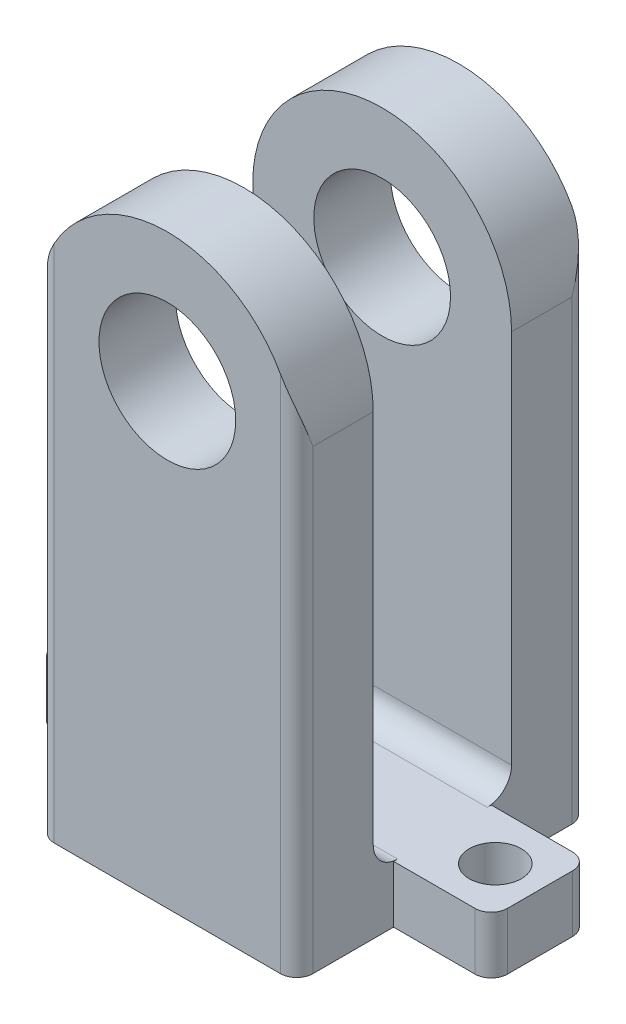
ISO-10303-21;
HEADER;
FILE_DESCRIPTION(('STEP AP214'),'2;1');
FILE_NAME('part.step','',(''),(''),'','','');
FILE_SCHEMA(('AUTOMOTIVE_DESIGN { 1 0 10303 214 1 1 1 1 }'));
ENDSEC;
DATA;
#1=APPLICATION_CONTEXT('core data for automotive mechanical design processes');
#2=APPLICATION_PROTOCOL_DEFINITION('international standard','automotive_design',2000,#1);
#3=PRODUCT_CONTEXT('',#1,'mechanical');
#4=PRODUCT('Part','Part','',(#3));
#5=PRODUCT_RELATED_PRODUCT_CATEGORY('part','',(#4));
#6=PRODUCT_DEFINITION_FORMATION('','',#4);
#7=PRODUCT_DEFINITION_CONTEXT('part definition',#1,'design');
#8=PRODUCT_DEFINITION('design','',#6,#7);
#9=PRODUCT_DEFINITION_SHAPE('','',#8);
#10=(LENGTH_UNIT() NAMED_UNIT(*) SI_UNIT(.MILLI.,.METRE.));
#11=(NAMED_UNIT(*) PLANE_ANGLE_UNIT() SI_UNIT($,.RADIAN.));
#12=(NAMED_UNIT(*) SI_UNIT($,.STERADIAN.) SOLID_ANGLE_UNIT());
#13=UNCERTAINTY_MEASURE_WITH_UNIT(LENGTH_MEASURE(1.E-05),#10,'distance_accuracy_value','');
#14=(GEOMETRIC_REPRESENTATION_CONTEXT(3) GLOBAL_UNCERTAINTY_ASSIGNED_CONTEXT((#13)) GLOBAL_UNIT_ASSIGNED_CONTEXT((#10,
#11,#12)) REPRESENTATION_CONTEXT('',''));
#15=CARTESIAN_POINT('',(0.,0.,0.));
#16=DIRECTION('',(0.,0.,1.));
#17=DIRECTION('',(1.,0.,0.));
#18=AXIS2_PLACEMENT_3D('',#15,#16,#17);
#19=CARTESIAN_POINT('',(0.,36.,8.95000000000001));
#20=DIRECTION('',(0.,0.,-1.));
#21=DIRECTION('',(-1.,0.,0.));
#22=AXIS2_PLACEMENT_3D('',#19,#20,#21);
#23=PLANE('',#22);
#24=CARTESIAN_POINT('',(0.,28.05,8.95000000000001));
#25=DIRECTION('',(0.,0.,1.));
#26=DIRECTION('',(1.,0.,0.));
#27=AXIS2_PLACEMENT_3D('',#24,#25,#26);
#28=CIRCLE('',#27,4.2);
#29=CARTESIAN_POINT('',(4.20000000000001,28.05,8.95000000000001));
#30=VERTEX_POINT('',#29);
#31=EDGE_CURVE('E351',#30,#30,#28,.T.);
#32=ORIENTED_EDGE('',*,*,#31,.F.);
#33=EDGE_LOOP('',(#32));
#34=FACE_BOUND('',#33,.T.);
#35=CARTESIAN_POINT('',(0.,28.05,8.95000000000001));
#36=DIRECTION('',(0.,0.,1.));
#37=DIRECTION('',(1.,0.,0.));
#38=AXIS2_PLACEMENT_3D('',#35,#36,#37);
#39=CIRCLE('',#38,7.95);
#40=CARTESIAN_POINT('',(6.95,31.9100518131238,8.95000000000001));
#41=VERTEX_POINT('',#40);
#42=CARTESIAN_POINT('',(-6.95,31.9100518131238,8.95000000000001));
#43=VERTEX_POINT('',#42);
#44=EDGE_CURVE('E263',#41,#43,#39,.T.);
#45=ORIENTED_EDGE('',*,*,#44,.T.);
#46=DIRECTION('',(0.,-1.,0.));
#47=VECTOR('',#46,1.);
#48=CARTESIAN_POINT('',(-6.94999999999999,36.,8.95000000000001));
#49=LINE('',#48,#47);
#50=CARTESIAN_POINT('',(-6.94999999999999,0.,8.95000000000001));
#51=VERTEX_POINT('',#50);
#52=EDGE_CURVE('E457',#43,#51,#49,.T.);
#53=ORIENTED_EDGE('',*,*,#52,.T.);
#54=DIRECTION('',(1.,0.,0.));
#55=VECTOR('',#54,1.);
#56=CARTESIAN_POINT('',(0.,0.,8.95000000000001));
#57=LINE('',#56,#55);
#58=CARTESIAN_POINT('',(6.95,0.,8.95));
#59=VERTEX_POINT('',#58);
#60=EDGE_CURVE('E472',#51,#59,#57,.T.);
#61=ORIENTED_EDGE('',*,*,#60,.T.);
#62=DIRECTION('',(0.,-1.,0.));
#63=VECTOR('',#62,1.);
#64=CARTESIAN_POINT('',(6.95,36.,8.95));
#65=LINE('',#64,#63);
#66=EDGE_CURVE('E289',#41,#59,#65,.T.);
#67=ORIENTED_EDGE('',*,*,#66,.F.);
#68=EDGE_LOOP('',(#45,#53,#61,#67));
#69=FACE_BOUND('',#68,.T.);
#70=ADVANCED_FACE('F79',(#34,#69),#23,.F.);
#71=CARTESIAN_POINT('',(0.,36.,-8.95000000000001));
#72=DIRECTION('',(0.,0.,-1.));
#73=DIRECTION('',(-1.,0.,0.));
#74=AXIS2_PLACEMENT_3D('',#71,#72,#73);
#75=PLANE('',#74);
#76=CARTESIAN_POINT('',(0.,28.05,-8.95000000000001));
#77=DIRECTION('',(0.,0.,1.));
#78=DIRECTION('',(1.,0.,0.));
#79=AXIS2_PLACEMENT_3D('',#76,#77,#78);
#80=CIRCLE('',#79,4.2);
#81=CARTESIAN_POINT('',(4.20000000000001,28.05,-8.95000000000001));
#82=VERTEX_POINT('',#81);
#83=EDGE_CURVE('E344',#82,#82,#80,.T.);
#84=ORIENTED_EDGE('',*,*,#83,.T.);
#85=EDGE_LOOP('',(#84));
#86=FACE_BOUND('',#85,.T.);
#87=DIRECTION('',(0.,-1.,0.));
#88=VECTOR('',#87,1.);
#89=CARTESIAN_POINT('',(-6.95,36.,-8.95000000000001));
#90=LINE('',#89,#88);
#91=CARTESIAN_POINT('',(-6.95,31.9100518131237,-8.95000000000001));
#92=VERTEX_POINT('',#91);
#93=CARTESIAN_POINT('',(-6.95,0.,-8.95000000000001));
#94=VERTEX_POINT('',#93);
#95=EDGE_CURVE('E269',#92,#94,#90,.T.);
#96=ORIENTED_EDGE('',*,*,#95,.F.);
#97=CARTESIAN_POINT('',(0.,28.05,-8.95000000000001));
#98=DIRECTION('',(0.,0.,1.));
#99=DIRECTION('',(1.,0.,0.));
#100=AXIS2_PLACEMENT_3D('',#97,#98,#99);
#101=CIRCLE('',#100,7.95);
#102=CARTESIAN_POINT('',(6.95,31.9100518131238,-8.95000000000001));
#103=VERTEX_POINT('',#102);
#104=EDGE_CURVE('E252',#103,#92,#101,.T.);
#105=ORIENTED_EDGE('',*,*,#104,.F.);
#106=DIRECTION('',(0.,-1.,0.));
#107=VECTOR('',#106,1.);
#108=CARTESIAN_POINT('',(6.95,36.,-8.95000000000001));
#109=LINE('',#108,#107);
#110=CARTESIAN_POINT('',(6.95,0.,-8.95000000000001));
#111=VERTEX_POINT('',#110);
#112=EDGE_CURVE('E278',#103,#111,#109,.T.);
#113=ORIENTED_EDGE('',*,*,#112,.T.);
#114=DIRECTION('',(1.,0.,0.));
#115=VECTOR('',#114,1.);
#116=CARTESIAN_POINT('',(0.,0.,-8.95000000000001));
#117=LINE('',#116,#115);
#118=EDGE_CURVE('E276',#94,#111,#117,.T.);
#119=ORIENTED_EDGE('',*,*,#118,.F.);
#120=EDGE_LOOP('',(#96,#105,#113,#119));
#121=FACE_BOUND('',#120,.T.);
#122=ADVANCED_FACE('F274',(#86,#121),#75,.T.);
#123=CARTESIAN_POINT('',(13.95,36.,-4.25));
#124=DIRECTION('',(0.,0.,-1.));
#125=DIRECTION('',(0.,1.,0.));
#126=AXIS2_PLACEMENT_3D('',#123,#124,#125);
#127=PLANE('',#126);
#128=CARTESIAN_POINT('',(0.,28.05,-4.25));
#129=DIRECTION('',(0.,0.,-1.));
#130=DIRECTION('',(0.,1.,0.));
#131=AXIS2_PLACEMENT_3D('',#128,#129,#130);
#132=CIRCLE('',#131,4.2);
#133=CARTESIAN_POINT('',(0.,32.25,-4.25));
#134=VERTEX_POINT('',#133);
#135=EDGE_CURVE('E343',#134,#134,#132,.T.);
#136=ORIENTED_EDGE('',*,*,#135,.T.);
#137=EDGE_LOOP('',(#136));
#138=FACE_BOUND('',#137,.T.);
#139=CARTESIAN_POINT('',(0.,28.05,-4.25));
#140=DIRECTION('',(0.,0.,-1.));
#141=DIRECTION('',(0.,1.,0.));
#142=AXIS2_PLACEMENT_3D('',#139,#140,#141);
#143=CIRCLE('',#142,7.95);
#144=CARTESIAN_POINT('',(-7.95,28.05,-4.25));
#145=VERTEX_POINT('',#144);
#146=CARTESIAN_POINT('',(7.95000000000001,28.05,-4.25));
#147=VERTEX_POINT('',#146);
#148=EDGE_CURVE('E348',#145,#147,#143,.T.);
#149=ORIENTED_EDGE('',*,*,#148,.F.);
#150=DIRECTION('',(0.,-1.,0.));
#151=VECTOR('',#150,1.);
#152=CARTESIAN_POINT('',(-7.95,36.,-4.25));
#153=LINE('',#152,#151);
#154=CARTESIAN_POINT('',(-7.95,5.,-4.25000000000001));
#155=VERTEX_POINT('',#154);
#156=EDGE_CURVE('E585',#145,#155,#153,.T.);
#157=ORIENTED_EDGE('',*,*,#156,.T.);
#158=DIRECTION('',(-1.,0.,0.));
#159=VECTOR('',#158,1.);
#160=CARTESIAN_POINT('',(13.95,5.,-4.25));
#161=LINE('',#160,#159);
#162=CARTESIAN_POINT('',(7.95,5.,-4.25));
#163=VERTEX_POINT('',#162);
#164=EDGE_CURVE('E569',#163,#155,#161,.T.);
#165=ORIENTED_EDGE('',*,*,#164,.F.);
#166=DIRECTION('',(0.,-1.,0.));
#167=VECTOR('',#166,1.);
#168=CARTESIAN_POINT('',(7.95,36.,-4.25));
#169=LINE('',#168,#167);
#170=EDGE_CURVE('E542',#147,#163,#169,.T.);
#171=ORIENTED_EDGE('',*,*,#170,.F.);
#172=EDGE_LOOP('',(#149,#157,#165,#171));
#173=FACE_BOUND('',#172,.T.);
#174=ADVANCED_FACE('F617',(#138,#173),#127,.F.);
#175=CARTESIAN_POINT('',(13.95,36.,4.25));
#176=DIRECTION('',(0.,0.,1.));
#177=DIRECTION('',(0.,-1.,0.));
#178=AXIS2_PLACEMENT_3D('',#175,#176,#177);
#179=PLANE('',#178);
#180=CARTESIAN_POINT('',(0.,28.05,4.25));
#181=DIRECTION('',(0.,0.,1.));
#182=DIRECTION('',(0.,-1.,0.));
#183=AXIS2_PLACEMENT_3D('',#180,#181,#182);
#184=CIRCLE('',#183,4.2);
#185=CARTESIAN_POINT('',(0.,23.85,4.25));
#186=VERTEX_POINT('',#185);
#187=EDGE_CURVE('E341',#186,#186,#184,.T.);
#188=ORIENTED_EDGE('',*,*,#187,.T.);
#189=EDGE_LOOP('',(#188));
#190=FACE_BOUND('',#189,.T.);
#191=DIRECTION('',(0.,1.,0.));
#192=VECTOR('',#191,1.);
#193=CARTESIAN_POINT('',(-7.95,36.,4.25));
#194=LINE('',#193,#192);
#195=CARTESIAN_POINT('',(-7.95,5.,4.25));
#196=VERTEX_POINT('',#195);
#197=CARTESIAN_POINT('',(-7.95,28.05,4.25));
#198=VERTEX_POINT('',#197);
#199=EDGE_CURVE('E573',#196,#198,#194,.T.);
#200=ORIENTED_EDGE('',*,*,#199,.T.);
#201=CARTESIAN_POINT('',(0.,28.05,4.25));
#202=DIRECTION('',(0.,0.,1.));
#203=DIRECTION('',(0.,-1.,0.));
#204=AXIS2_PLACEMENT_3D('',#201,#202,#203);
#205=CIRCLE('',#204,7.95);
#206=CARTESIAN_POINT('',(7.95,28.05,4.25));
#207=VERTEX_POINT('',#206);
#208=EDGE_CURVE('E12',#207,#198,#205,.T.);
#209=ORIENTED_EDGE('',*,*,#208,.F.);
#210=DIRECTION('',(0.,1.,0.));
#211=VECTOR('',#210,1.);
#212=CARTESIAN_POINT('',(7.95,36.,4.25));
#213=LINE('',#212,#211);
#214=CARTESIAN_POINT('',(7.95,5.,4.25));
#215=VERTEX_POINT('',#214);
#216=EDGE_CURVE('E544',#215,#207,#213,.T.);
#217=ORIENTED_EDGE('',*,*,#216,.F.);
#218=DIRECTION('',(-1.,0.,0.));
#219=VECTOR('',#218,1.);
#220=CARTESIAN_POINT('',(13.95,5.,4.25000000000001));
#221=LINE('',#220,#219);
#222=EDGE_CURVE('E568',#215,#196,#221,.T.);
#223=ORIENTED_EDGE('',*,*,#222,.T.);
#224=EDGE_LOOP('',(#200,#209,#217,#223));
#225=FACE_BOUND('',#224,.T.);
#226=ADVANCED_FACE('F613',(#190,#225),#179,.F.);
#227=CARTESIAN_POINT('',(-6.95,36.,-7.95));
#228=DIRECTION('',(0.,-1.,0.));
#229=DIRECTION('',(0.,0.,-1.));
#230=AXIS2_PLACEMENT_3D('',#227,#228,#229);
#231=CYLINDRICAL_SURFACE('',#230,1.);
#232=DIRECTION('',(0.,-1.,0.));
#233=VECTOR('',#232,1.);
#234=CARTESIAN_POINT('',(-7.95,36.,-7.95));
#235=LINE('',#234,#233);
#236=CARTESIAN_POINT('',(-7.95,28.05,-7.95));
#237=VERTEX_POINT('',#236);
#238=CARTESIAN_POINT('',(-7.95,0.,-7.95));
#239=VERTEX_POINT('',#238);
#240=EDGE_CURVE('E271',#237,#239,#235,.T.);
#241=ORIENTED_EDGE('',*,*,#240,.F.);
#242=CARTESIAN_POINT('',(-6.95,31.9100518131238,-8.95));
#243=CARTESIAN_POINT('',(-6.98196957690838,31.8524932022334,-8.94999105364568));
#244=CARTESIAN_POINT('',(-7.01321143036814,31.7945552499935,-8.94846815566665));
#245=CARTESIAN_POINT('',(-7.07418330680163,31.6780500916359,-8.94273329318418));
#246=CARTESIAN_POINT('',(-7.10391397826668,31.6194831687225,-8.93852249283603));
#247=CARTESIAN_POINT('',(-7.1906636865138,31.4432250551329,-8.92238833535052));
#248=CARTESIAN_POINT('',(-7.24538600971994,31.3247141109602,-8.9069600865594));
#249=CARTESIAN_POINT('',(-7.34829715396004,31.0867367492369,-8.86888738764515));
#250=CARTESIAN_POINT('',(-7.39651452418672,30.9672771172871,-8.84627603536577));
#251=CARTESIAN_POINT('',(-7.48676855125309,30.7271741436401,-8.79531932279048));
#252=CARTESIAN_POINT('',(-7.52880060460707,30.6065299908738,-8.76696972865254));
#253=CARTESIAN_POINT('',(-7.6317744010863,30.2865526451457,-8.68608268360056));
#254=CARTESIAN_POINT('',(-7.68750287763086,30.0864897392749,-8.62971148798475));
#255=CARTESIAN_POINT('',(-7.78278866369012,29.6850330622182,-8.50891052122256));
#256=CARTESIAN_POINT('',(-7.82233901986873,29.4836387565071,-8.44447730053193));
#257=CARTESIAN_POINT('',(-7.91732867090153,28.8779003985088,-8.24362857351878));
#258=CARTESIAN_POINT('',(-7.94912616679685,28.4719388902881,-8.09964635034349));
#259=CARTESIAN_POINT('',(-7.94999407288117,28.0612043917698,-7.95397376413446));
#260=CARTESIAN_POINT('',(-7.94999999416563,28.0556021126278,-7.95198683997217));
#261=CARTESIAN_POINT('',(-7.95,28.05,-7.95));
#262=B_SPLINE_CURVE_WITH_KNOTS('',3,(#242,#243,#244,#245,#246,#247,#248,#249,#250,#251,#252,
#253,#254,#255,#256,#257,#258,#259,#260,#261),.UNSPECIFIED.,.F.,.F.,(4,2,2,2,2,2,2,2,2,4),(0.,
0.197466297953649,0.394847129408488,0.788711816861617,1.18078737943405,1.57315328825401,
2.21774444285081,2.86261235156548,4.15214798750188,4.16998055085129),.UNSPECIFIED.);
#263=EDGE_CURVE('E256',#237,#92,#262,.F.);
#264=ORIENTED_EDGE('',*,*,#263,.T.);
#265=ORIENTED_EDGE('',*,*,#95,.T.);
#266=CARTESIAN_POINT('',(-6.95,0.,-7.95));
#267=DIRECTION('',(0.,1.,0.));
#268=DIRECTION('',(0.,0.,1.));
#269=AXIS2_PLACEMENT_3D('',#266,#267,#268);
#270=CIRCLE('',#269,1.);
#271=EDGE_CURVE('E448',#239,#94,#270,.F.);
#272=ORIENTED_EDGE('',*,*,#271,.F.);
#273=EDGE_LOOP('',(#241,#264,#265,#272));
#274=FACE_BOUND('',#273,.T.);
#275=ADVANCED_FACE('F267',(#274),#231,.T.);
#276=CARTESIAN_POINT('',(-6.95,36.,7.95));
#277=DIRECTION('',(0.,-1.,0.));
#278=DIRECTION('',(0.,0.,-1.));
#279=AXIS2_PLACEMENT_3D('',#276,#277,#278);
#280=CYLINDRICAL_SURFACE('',#279,1.);
#281=ORIENTED_EDGE('',*,*,#52,.F.);
#282=CARTESIAN_POINT('',(-6.94999999999999,31.9100518131238,8.95000000000001));
#283=CARTESIAN_POINT('',(-6.9819695769084,31.8524932022333,8.94999105364569));
#284=CARTESIAN_POINT('',(-7.01321143036819,31.7945552499934,8.94846815566665));
#285=CARTESIAN_POINT('',(-7.07418330680172,31.6780500916357,8.94273329318418));
#286=CARTESIAN_POINT('',(-7.10391397826679,31.6194831687223,8.93852249283602));
#287=CARTESIAN_POINT('',(-7.19066368651397,31.4432250551326,8.92238833535049));
#288=CARTESIAN_POINT('',(-7.24538600972013,31.3247141109598,8.90696008655935));
#289=CARTESIAN_POINT('',(-7.3482971539602,31.0867367492365,8.86888738764508));
#290=CARTESIAN_POINT('',(-7.39651452418684,30.9672771172868,8.8462760353657));
#291=CARTESIAN_POINT('',(-7.48676855125314,30.72717414364,8.79531932279045));
#292=CARTESIAN_POINT('',(-7.52880060460709,30.6065299908737,8.76696972865255));
#293=CARTESIAN_POINT('',(-7.6317744010863,30.2865526451457,8.68608268360053));
#294=CARTESIAN_POINT('',(-7.68750287763085,30.086489739275,8.62971148798459));
#295=CARTESIAN_POINT('',(-7.7827886636901,29.6850330622183,8.50891052122277));
#296=CARTESIAN_POINT('',(-7.8223390198687,29.483638756507,8.44447730053262));
#297=CARTESIAN_POINT('',(-7.91732867090153,28.8779003985094,8.2436285735175));
#298=CARTESIAN_POINT('',(-7.9491261667969,28.4719388902906,8.09964635033632));
#299=CARTESIAN_POINT('',(-7.94999407288116,28.0612043917699,7.95397376413426));
#300=CARTESIAN_POINT('',(-7.94999999416563,28.0556021126279,7.95198683997207));
#301=CARTESIAN_POINT('',(-7.95,28.05,7.95));
#302=B_SPLINE_CURVE_WITH_KNOTS('',3,(#282,#283,#284,#285,#286,#287,#288,#289,#290,#291,#292,
#293,#294,#295,#296,#297,#298,#299,#300,#301),.UNSPECIFIED.,.F.,.F.,(4,2,2,2,2,2,2,2,2,4),(0.,
0.197466297953814,0.394847129408806,0.788711816862168,1.18078737943431,1.573153288254,
2.21774444285077,2.86261235156531,4.15214798750191,4.16998055085129),.UNSPECIFIED.);
#303=CARTESIAN_POINT('',(-7.95,28.05,7.95));
#304=VERTEX_POINT('',#303);
#305=EDGE_CURVE('E272',#43,#304,#302,.T.);
#306=ORIENTED_EDGE('',*,*,#305,.T.);
#307=DIRECTION('',(0.,-1.,0.));
#308=VECTOR('',#307,1.);
#309=CARTESIAN_POINT('',(-7.95,36.,7.95));
#310=LINE('',#309,#308);
#311=CARTESIAN_POINT('',(-7.95,0.,7.95));
#312=VERTEX_POINT('',#311);
#313=EDGE_CURVE('E282',#304,#312,#310,.T.);
#314=ORIENTED_EDGE('',*,*,#313,.T.);
#315=CARTESIAN_POINT('',(-6.95,0.,7.95));
#316=DIRECTION('',(0.,1.,0.));
#317=DIRECTION('',(0.,0.,1.));
#318=AXIS2_PLACEMENT_3D('',#315,#316,#317);
#319=CIRCLE('',#318,1.);
#320=EDGE_CURVE('E451',#51,#312,#319,.F.);
#321=ORIENTED_EDGE('',*,*,#320,.F.);
#322=EDGE_LOOP('',(#281,#306,#314,#321));
#323=FACE_BOUND('',#322,.T.);
#324=ADVANCED_FACE('F394',(#323),#280,.T.);
#325=CARTESIAN_POINT('',(6.95,36.,7.95));
#326=DIRECTION('',(0.,-1.,0.));
#327=DIRECTION('',(0.,0.,-1.));
#328=AXIS2_PLACEMENT_3D('',#325,#326,#327);
#329=CYLINDRICAL_SURFACE('',#328,1.);
#330=DIRECTION('',(0.,-1.,0.));
#331=VECTOR('',#330,1.);
#332=CARTESIAN_POINT('',(7.95,36.,7.95));
#333=LINE('',#332,#331);
#334=CARTESIAN_POINT('',(7.95000000000001,28.05,7.95));
#335=VERTEX_POINT('',#334);
#336=CARTESIAN_POINT('',(7.95,0.,7.95));
#337=VERTEX_POINT('',#336);
#338=EDGE_CURVE('E287',#335,#337,#333,.T.);
#339=ORIENTED_EDGE('',*,*,#338,.F.);
#340=CARTESIAN_POINT('',(6.95,31.9100518131238,8.95));
#341=CARTESIAN_POINT('',(6.98196957690846,31.8524932022332,8.94999105364568));
#342=CARTESIAN_POINT('',(7.0132114303683,31.7945552499932,8.94846815566665));
#343=CARTESIAN_POINT('',(7.07418330680192,31.6780500916353,8.94273329318415));
#344=CARTESIAN_POINT('',(7.10391397826704,31.6194831687218,8.93852249283598));
#345=CARTESIAN_POINT('',(7.19066368651431,31.4432250551319,8.9223883353504));
#346=CARTESIAN_POINT('',(7.24538600972054,31.3247141109589,8.90696008655923));
#347=CARTESIAN_POINT('',(7.34829715396056,31.0867367492356,8.86888738764491));
#348=CARTESIAN_POINT('',(7.39651452418711,30.9672771172861,8.84627603536555));
#349=CARTESIAN_POINT('',(7.48676855125326,30.7271741436397,8.79531932279038));
#350=CARTESIAN_POINT('',(7.52880060460715,30.6065299908735,8.76696972865254));
#351=CARTESIAN_POINT('',(7.6317744010863,30.2865526451457,8.68608268360046));
#352=CARTESIAN_POINT('',(7.68750287763084,30.0864897392752,8.62971148798425));
#353=CARTESIAN_POINT('',(7.78278866369006,29.6850330622183,8.50891052122317));
#354=CARTESIAN_POINT('',(7.82233901986865,29.4836387565068,8.44447730053404));
#355=CARTESIAN_POINT('',(7.91732867090154,28.8779003985106,8.2436285735149));
#356=CARTESIAN_POINT('',(7.94912616679698,28.471938890296,8.0996463503217));
#357=CARTESIAN_POINT('',(7.94999407288117,28.0612043917701,7.95397376413386));
#358=CARTESIAN_POINT('',(7.94999999416563,28.0556021126279,7.95198683997186));
#359=CARTESIAN_POINT('',(7.95,28.05,7.95));
#360=B_SPLINE_CURVE_WITH_KNOTS('',3,(#340,#341,#342,#343,#344,#345,#346,#347,#348,#349,#350,
#351,#352,#353,#354,#355,#356,#357,#358,#359),.UNSPECIFIED.,.F.,.F.,(4,2,2,2,2,2,2,2,2,4),(0.,
0.197466297954126,0.394847129409439,0.788711816863296,1.18078737943484,1.57315328825401,
2.21774444285067,2.86261235156492,4.15214798750188,4.16998055085128),.UNSPECIFIED.);
#361=EDGE_CURVE('E369',#335,#41,#360,.F.);
#362=ORIENTED_EDGE('',*,*,#361,.T.);
#363=ORIENTED_EDGE('',*,*,#66,.T.);
#364=CARTESIAN_POINT('',(6.95,0.,7.95));
#365=DIRECTION('',(0.,1.,0.));
#366=DIRECTION('',(0.,0.,1.));
#367=AXIS2_PLACEMENT_3D('',#364,#365,#366);
#368=CIRCLE('',#367,1.);
#369=EDGE_CURVE('E475',#337,#59,#368,.F.);
#370=ORIENTED_EDGE('',*,*,#369,.F.);
#371=EDGE_LOOP('',(#339,#362,#363,#370));
#372=FACE_BOUND('',#371,.T.);
#373=ADVANCED_FACE('F384',(#372),#329,.T.);
#374=CARTESIAN_POINT('',(6.95,36.,-7.95));
#375=DIRECTION('',(0.,-1.,0.));
#376=DIRECTION('',(0.,0.,-1.));
#377=AXIS2_PLACEMENT_3D('',#374,#375,#376);
#378=CYLINDRICAL_SURFACE('',#377,1.);
#379=CARTESIAN_POINT('',(6.95,31.9100518131238,-8.95));
#380=CARTESIAN_POINT('',(6.98196957690845,31.8524932022332,-8.94999105364568));
#381=CARTESIAN_POINT('',(7.01321143036829,31.7945552499932,-8.94846815566665));
#382=CARTESIAN_POINT('',(7.07418330680192,31.6780500916353,-8.94273329318415));
#383=CARTESIAN_POINT('',(7.10391397826703,31.6194831687218,-8.93852249283598));
#384=CARTESIAN_POINT('',(7.19066368651431,31.4432250551319,-8.9223883353504));
#385=CARTESIAN_POINT('',(7.24538600972053,31.3247141109589,-8.90696008655923));
#386=CARTESIAN_POINT('',(7.34829715396055,31.0867367492356,-8.86888738764491));
#387=CARTESIAN_POINT('',(7.3965145241871,30.9672771172861,-8.84627603536555));
#388=CARTESIAN_POINT('',(7.48676855125326,30.7271741436397,-8.79531932279038));
#389=CARTESIAN_POINT('',(7.52880060460714,30.6065299908735,-8.76696972865254));
#390=CARTESIAN_POINT('',(7.63177440108629,30.2865526451458,-8.68608268360046));
#391=CARTESIAN_POINT('',(7.68750287763084,30.0864897392752,-8.62971148798426));
#392=CARTESIAN_POINT('',(7.78278866369006,29.6850330622183,-8.50891052122317));
#393=CARTESIAN_POINT('',(7.82233901986864,29.4836387565068,-8.44447730053405));
#394=CARTESIAN_POINT('',(7.91732867090153,28.8779003985106,-8.2436285735149));
#395=CARTESIAN_POINT('',(7.94912616679698,28.471938890296,-8.09964635032167));
#396=CARTESIAN_POINT('',(7.94999407288117,28.0612043917701,-7.95397376413386));
#397=CARTESIAN_POINT('',(7.94999999416563,28.0556021126279,-7.95198683997186));
#398=CARTESIAN_POINT('',(7.95,28.05,-7.95));
#399=B_SPLINE_CURVE_WITH_KNOTS('',3,(#379,#380,#381,#382,#383,#384,#385,#386,#387,#388,#389,
#390,#391,#392,#393,#394,#395,#396,#397,#398),.UNSPECIFIED.,.F.,.F.,(4,2,2,2,2,2,2,2,2,4),(0.,
0.197466297954127,0.39484712940944,0.788711816863293,1.18078737943482,1.57315328825399,
2.21774444285065,2.86261235156491,4.15214798750189,4.16998055085129),.UNSPECIFIED.);
#400=CARTESIAN_POINT('',(7.95000000000001,28.05,-7.95));
#401=VERTEX_POINT('',#400);
#402=EDGE_CURVE('E259',#401,#103,#399,.F.);
#403=ORIENTED_EDGE('',*,*,#402,.F.);
#404=DIRECTION('',(0.,-1.,0.));
#405=VECTOR('',#404,1.);
#406=CARTESIAN_POINT('',(7.95,36.,-7.95));
#407=LINE('',#406,#405);
#408=CARTESIAN_POINT('',(7.95,0.,-7.95));
#409=VERTEX_POINT('',#408);
#410=EDGE_CURVE('E280',#401,#409,#407,.T.);
#411=ORIENTED_EDGE('',*,*,#410,.T.);
#412=CARTESIAN_POINT('',(6.95,0.,-7.95));
#413=DIRECTION('',(0.,1.,0.));
#414=DIRECTION('',(0.,0.,1.));
#415=AXIS2_PLACEMENT_3D('',#412,#413,#414);
#416=CIRCLE('',#415,1.);
#417=EDGE_CURVE('E488',#409,#111,#416,.T.);
#418=ORIENTED_EDGE('',*,*,#417,.T.);
#419=ORIENTED_EDGE('',*,*,#112,.F.);
#420=EDGE_LOOP('',(#403,#411,#418,#419));
#421=FACE_BOUND('',#420,.T.);
#422=ADVANCED_FACE('F378',(#421),#378,.T.);
#423=CARTESIAN_POINT('',(7.95,36.,0.));
#424=DIRECTION('',(-1.,0.,0.));
#425=DIRECTION('',(0.,0.,1.));
#426=AXIS2_PLACEMENT_3D('',#423,#424,#425);
#427=PLANE('',#426);
#428=ORIENTED_EDGE('',*,*,#216,.T.);
#429=DIRECTION('',(0.,0.,1.));
#430=VECTOR('',#429,1.);
#431=CARTESIAN_POINT('',(7.95000000000001,28.05,-8.95000000000001));
#432=LINE('',#431,#430);
#433=EDGE_CURVE('E93',#207,#335,#432,.T.);
#434=ORIENTED_EDGE('',*,*,#433,.T.);
#435=ORIENTED_EDGE('',*,*,#338,.T.);
#436=DIRECTION('',(0.,0.,-1.));
#437=VECTOR('',#436,1.);
#438=CARTESIAN_POINT('',(7.95,0.,0.));
#439=LINE('',#438,#437);
#440=CARTESIAN_POINT('',(7.95,0.,3.));
#441=VERTEX_POINT('',#440);
#442=EDGE_CURVE('E486',#337,#441,#439,.T.);
#443=ORIENTED_EDGE('',*,*,#442,.T.);
#444=DIRECTION('',(0.,-1.,0.));
#445=VECTOR('',#444,1.);
#446=CARTESIAN_POINT('',(7.95,3.5,3.));
#447=LINE('',#446,#445);
#448=CARTESIAN_POINT('',(7.95,3.5,3.));
#449=VERTEX_POINT('',#448);
#450=EDGE_CURVE('E501',#449,#441,#447,.T.);
#451=ORIENTED_EDGE('',*,*,#450,.F.);
#452=DIRECTION('',(0.,0.,-1.));
#453=VECTOR('',#452,1.);
#454=CARTESIAN_POINT('',(7.95,3.5,0.));
#455=LINE('',#454,#453);
#456=CARTESIAN_POINT('',(7.95,3.5,2.75));
#457=VERTEX_POINT('',#456);
#458=EDGE_CURVE('E552',#449,#457,#455,.T.);
#459=ORIENTED_EDGE('',*,*,#458,.T.);
#460=CARTESIAN_POINT('',(7.95,5.,2.75000000000001));
#461=DIRECTION('',(-1.,0.,0.));
#462=DIRECTION('',(0.,0.,1.));
#463=AXIS2_PLACEMENT_3D('',#460,#461,#462);
#464=CIRCLE('',#463,1.5);
#465=EDGE_CURVE('E563',#457,#215,#464,.T.);
#466=ORIENTED_EDGE('',*,*,#465,.T.);
#467=EDGE_LOOP('',(#428,#434,#435,#443,#451,#459,#466));
#468=FACE_BOUND('',#467,.T.);
#469=ADVANCED_FACE('F383',(#468),#427,.F.);
#470=CARTESIAN_POINT('',(-7.95,36.,0.));
#471=DIRECTION('',(-1.,0.,0.));
#472=DIRECTION('',(0.,0.,1.));
#473=AXIS2_PLACEMENT_3D('',#470,#471,#472);
#474=PLANE('',#473);
#475=DIRECTION('',(0.,0.,1.));
#476=VECTOR('',#475,1.);
#477=CARTESIAN_POINT('',(-7.95,28.05,-8.95000000000001));
#478=LINE('',#477,#476);
#479=EDGE_CURVE('E592',#198,#304,#478,.T.);
#480=ORIENTED_EDGE('',*,*,#479,.F.);
#481=ORIENTED_EDGE('',*,*,#199,.F.);
#482=CARTESIAN_POINT('',(-7.95,5.,2.75));
#483=DIRECTION('',(-1.,0.,0.));
#484=DIRECTION('',(0.,0.,1.));
#485=AXIS2_PLACEMENT_3D('',#482,#483,#484);
#486=CIRCLE('',#485,1.5);
#487=CARTESIAN_POINT('',(-7.95,3.5,2.75));
#488=VERTEX_POINT('',#487);
#489=EDGE_CURVE('E580',#488,#196,#486,.T.);
#490=ORIENTED_EDGE('',*,*,#489,.F.);
#491=DIRECTION('',(0.,0.,-1.));
#492=VECTOR('',#491,1.);
#493=CARTESIAN_POINT('',(-7.95,3.5,0.));
#494=LINE('',#493,#492);
#495=CARTESIAN_POINT('',(-7.95,3.5,3.));
#496=VERTEX_POINT('',#495);
#497=EDGE_CURVE('E308',#496,#488,#494,.T.);
#498=ORIENTED_EDGE('',*,*,#497,.F.);
#499=DIRECTION('',(0.,-1.,0.));
#500=VECTOR('',#499,1.);
#501=CARTESIAN_POINT('',(-7.95,3.5,3.));
#502=LINE('',#501,#500);
#503=CARTESIAN_POINT('',(-7.95,0.,3.));
#504=VERTEX_POINT('',#503);
#505=EDGE_CURVE('E333',#496,#504,#502,.T.);
#506=ORIENTED_EDGE('',*,*,#505,.T.);
#507=DIRECTION('',(0.,0.,-1.));
#508=VECTOR('',#507,1.);
#509=CARTESIAN_POINT('',(-7.95,0.,0.));
#510=LINE('',#509,#508);
#511=EDGE_CURVE('E447',#312,#504,#510,.T.);
#512=ORIENTED_EDGE('',*,*,#511,.F.);
#513=ORIENTED_EDGE('',*,*,#313,.F.);
#514=EDGE_LOOP('',(#480,#481,#490,#498,#506,#512,#513));
#515=FACE_BOUND('',#514,.T.);
#516=ADVANCED_FACE('F390',(#515),#474,.T.);
#517=ORIENTED_EDGE('',*,*,#410,.F.);
#518=EDGE_CURVE('E356',#401,#147,#432,.T.);
#519=ORIENTED_EDGE('',*,*,#518,.T.);
#520=ORIENTED_EDGE('',*,*,#170,.T.);
#521=CARTESIAN_POINT('',(7.95,5.,-2.75));
#522=DIRECTION('',(-1.,0.,0.));
#523=DIRECTION('',(0.,0.,1.));
#524=AXIS2_PLACEMENT_3D('',#521,#522,#523);
#525=CIRCLE('',#524,1.5);
#526=CARTESIAN_POINT('',(7.95,3.5,-2.75));
#527=VERTEX_POINT('',#526);
#528=EDGE_CURVE('E566',#163,#527,#525,.T.);
#529=ORIENTED_EDGE('',*,*,#528,.T.);
#530=CARTESIAN_POINT('',(7.95,3.5,-3.00000000000001));
#531=VERTEX_POINT('',#530);
#532=EDGE_CURVE('E101',#527,#531,#455,.T.);
#533=ORIENTED_EDGE('',*,*,#532,.T.);
#534=DIRECTION('',(0.,-1.,0.));
#535=VECTOR('',#534,1.);
#536=CARTESIAN_POINT('',(7.95,3.5,-3.));
#537=LINE('',#536,#535);
#538=CARTESIAN_POINT('',(7.95,0.,-3.));
#539=VERTEX_POINT('',#538);
#540=EDGE_CURVE('E496',#531,#539,#537,.T.);
#541=ORIENTED_EDGE('',*,*,#540,.T.);
#542=EDGE_CURVE('E480',#539,#409,#439,.T.);
#543=ORIENTED_EDGE('',*,*,#542,.T.);
#544=EDGE_LOOP('',(#517,#519,#520,#529,#533,#541,#543));
#545=FACE_BOUND('',#544,.T.);
#546=ADVANCED_FACE('F387',(#545),#427,.F.);
#547=CARTESIAN_POINT('',(-12.95,3.5,-2.));
#548=DIRECTION('',(0.,-1.,0.));
#549=DIRECTION('',(0.,0.,-1.));
#550=AXIS2_PLACEMENT_3D('',#547,#548,#549);
#551=CYLINDRICAL_SURFACE('',#550,1.);
#552=CARTESIAN_POINT('',(-12.95,0.,-2.));
#553=DIRECTION('',(0.,1.,0.));
#554=DIRECTION('',(0.,0.,1.));
#555=AXIS2_PLACEMENT_3D('',#552,#553,#554);
#556=CIRCLE('',#555,1.);
#557=CARTESIAN_POINT('',(-13.95,0.,-2.));
#558=VERTEX_POINT('',#557);
#559=CARTESIAN_POINT('',(-12.95,0.,-3.));
#560=VERTEX_POINT('',#559);
#561=EDGE_CURVE('E317',#558,#560,#556,.F.);
#562=ORIENTED_EDGE('',*,*,#561,.F.);
#563=DIRECTION('',(0.,-1.,0.));
#564=VECTOR('',#563,1.);
#565=CARTESIAN_POINT('',(-13.95,3.5,-2.));
#566=LINE('',#565,#564);
#567=CARTESIAN_POINT('',(-13.95,3.5,-2.));
#568=VERTEX_POINT('',#567);
#569=EDGE_CURVE('E87',#568,#558,#566,.T.);
#570=ORIENTED_EDGE('',*,*,#569,.F.);
#571=CARTESIAN_POINT('',(-12.95,3.5,-2.));
#572=DIRECTION('',(0.,1.,0.));
#573=DIRECTION('',(0.,0.,1.));
#574=AXIS2_PLACEMENT_3D('',#571,#572,#573);
#575=CIRCLE('',#574,1.);
#576=CARTESIAN_POINT('',(-12.95,3.5,-3.));
#577=VERTEX_POINT('',#576);
#578=EDGE_CURVE('E295',#568,#577,#575,.F.);
#579=ORIENTED_EDGE('',*,*,#578,.T.);
#580=DIRECTION('',(0.,-1.,0.));
#581=VECTOR('',#580,1.);
#582=CARTESIAN_POINT('',(-12.95,3.5,-3.));
#583=LINE('',#582,#581);
#584=EDGE_CURVE('E314',#577,#560,#583,.T.);
#585=ORIENTED_EDGE('',*,*,#584,.T.);
#586=EDGE_LOOP('',(#562,#570,#579,#585));
#587=FACE_BOUND('',#586,.T.);
#588=ADVANCED_FACE('F389',(#587),#551,.T.);
#589=CARTESIAN_POINT('',(-13.95,3.5,0.));
#590=DIRECTION('',(-1.,0.,0.));
#591=DIRECTION('',(0.,0.,1.));
#592=AXIS2_PLACEMENT_3D('',#589,#590,#591);
#593=PLANE('',#592);
#594=DIRECTION('',(0.,0.,-1.));
#595=VECTOR('',#594,1.);
#596=CARTESIAN_POINT('',(-13.95,0.,0.));
#597=LINE('',#596,#595);
#598=CARTESIAN_POINT('',(-13.95,0.,2.));
#599=VERTEX_POINT('',#598);
#600=EDGE_CURVE('E320',#599,#558,#597,.T.);
#601=ORIENTED_EDGE('',*,*,#600,.F.);
#602=DIRECTION('',(0.,-1.,0.));
#603=VECTOR('',#602,1.);
#604=CARTESIAN_POINT('',(-13.95,3.5,2.));
#605=LINE('',#604,#603);
#606=CARTESIAN_POINT('',(-13.95,3.5,2.));
#607=VERTEX_POINT('',#606);
#608=EDGE_CURVE('E339',#607,#599,#605,.T.);
#609=ORIENTED_EDGE('',*,*,#608,.F.);
#610=DIRECTION('',(0.,0.,-1.));
#611=VECTOR('',#610,1.);
#612=CARTESIAN_POINT('',(-13.95,3.5,0.));
#613=LINE('',#612,#611);
#614=EDGE_CURVE('E299',#607,#568,#613,.T.);
#615=ORIENTED_EDGE('',*,*,#614,.T.);
#616=ORIENTED_EDGE('',*,*,#569,.T.);
#617=EDGE_LOOP('',(#601,#609,#615,#616));
#618=FACE_BOUND('',#617,.T.);
#619=ADVANCED_FACE('F419',(#618),#593,.T.);
#620=CARTESIAN_POINT('',(-12.95,3.5,2.));
#621=DIRECTION('',(0.,-1.,0.));
#622=DIRECTION('',(0.,0.,-1.));
#623=AXIS2_PLACEMENT_3D('',#620,#621,#622);
#624=CYLINDRICAL_SURFACE('',#623,1.);
#625=CARTESIAN_POINT('',(-12.95,0.,2.));
#626=DIRECTION('',(0.,1.,0.));
#627=DIRECTION('',(0.,0.,1.));
#628=AXIS2_PLACEMENT_3D('',#625,#626,#627);
#629=CIRCLE('',#628,1.);
#630=CARTESIAN_POINT('',(-12.95,0.,3.));
#631=VERTEX_POINT('',#630);
#632=EDGE_CURVE('E323',#599,#631,#629,.T.);
#633=ORIENTED_EDGE('',*,*,#632,.T.);
#634=DIRECTION('',(0.,-1.,0.));
#635=VECTOR('',#634,1.);
#636=CARTESIAN_POINT('',(-12.95,3.5,3.));
#637=LINE('',#636,#635);
#638=CARTESIAN_POINT('',(-12.95,3.5,3.));
#639=VERTEX_POINT('',#638);
#640=EDGE_CURVE('E336',#639,#631,#637,.T.);
#641=ORIENTED_EDGE('',*,*,#640,.F.);
#642=CARTESIAN_POINT('',(-12.95,3.5,2.));
#643=DIRECTION('',(0.,1.,0.));
#644=DIRECTION('',(0.,0.,1.));
#645=AXIS2_PLACEMENT_3D('',#642,#643,#644);
#646=CIRCLE('',#645,1.);
#647=EDGE_CURVE('E302',#607,#639,#646,.T.);
#648=ORIENTED_EDGE('',*,*,#647,.F.);
#649=ORIENTED_EDGE('',*,*,#608,.T.);
#650=EDGE_LOOP('',(#633,#641,#648,#649));
#651=FACE_BOUND('',#650,.T.);
#652=ADVANCED_FACE('F415',(#651),#624,.T.);
#653=CARTESIAN_POINT('',(0.,3.5,3.));
#654=DIRECTION('',(0.,0.,-1.));
#655=DIRECTION('',(-1.,0.,0.));
#656=AXIS2_PLACEMENT_3D('',#653,#654,#655);
#657=PLANE('',#656);
#658=DIRECTION('',(1.,0.,0.));
#659=VECTOR('',#658,1.);
#660=CARTESIAN_POINT('',(0.,0.,3.));
#661=LINE('',#660,#659);
#662=EDGE_CURVE('E326',#631,#504,#661,.T.);
#663=ORIENTED_EDGE('',*,*,#662,.T.);
#664=ORIENTED_EDGE('',*,*,#505,.F.);
#665=DIRECTION('',(1.,0.,0.));
#666=VECTOR('',#665,1.);
#667=CARTESIAN_POINT('',(0.,3.5,3.));
#668=LINE('',#667,#666);
#669=EDGE_CURVE('E305',#639,#496,#668,.T.);
#670=ORIENTED_EDGE('',*,*,#669,.F.);
#671=ORIENTED_EDGE('',*,*,#640,.T.);
#672=EDGE_LOOP('',(#663,#664,#670,#671));
#673=FACE_BOUND('',#672,.T.);
#674=ADVANCED_FACE('F412',(#673),#657,.F.);
#675=CARTESIAN_POINT('',(-11.2,3.5,0.));
#676=DIRECTION('',(0.,-1.,0.));
#677=DIRECTION('',(0.,0.,-1.));
#678=AXIS2_PLACEMENT_3D('',#675,#676,#677);
#679=CYLINDRICAL_SURFACE('',#678,1.6);
#680=CARTESIAN_POINT('',(-11.2,3.5,0.));
#681=DIRECTION('',(0.,1.,0.));
#682=DIRECTION('',(0.,0.,1.));
#683=AXIS2_PLACEMENT_3D('',#680,#681,#682);
#684=CIRCLE('',#683,1.6);
#685=CARTESIAN_POINT('',(-11.2,3.5,1.6));
#686=VERTEX_POINT('',#685);
#687=EDGE_CURVE('E292',#686,#686,#684,.T.);
#688=ORIENTED_EDGE('',*,*,#687,.T.);
#689=EDGE_LOOP('',(#688));
#690=FACE_BOUND('',#689,.T.);
#691=CARTESIAN_POINT('',(-11.2,0.,0.));
#692=DIRECTION('',(0.,1.,0.));
#693=DIRECTION('',(0.,0.,1.));
#694=AXIS2_PLACEMENT_3D('',#691,#692,#693);
#695=CIRCLE('',#694,1.6);
#696=CARTESIAN_POINT('',(-11.2,0.,1.6));
#697=VERTEX_POINT('',#696);
#698=EDGE_CURVE('E291',#697,#697,#695,.T.);
#699=ORIENTED_EDGE('',*,*,#698,.F.);
#700=EDGE_LOOP('',(#699));
#701=FACE_BOUND('',#700,.T.);
#702=ADVANCED_FACE('F81',(#690,#701),#679,.F.);
#703=CARTESIAN_POINT('',(0.,3.5,-3.));
#704=DIRECTION('',(0.,0.,-1.));
#705=DIRECTION('',(-1.,0.,0.));
#706=AXIS2_PLACEMENT_3D('',#703,#704,#705);
#707=PLANE('',#706);
#708=DIRECTION('',(1.,0.,0.));
#709=VECTOR('',#708,1.);
#710=CARTESIAN_POINT('',(0.,0.,-3.));
#711=LINE('',#710,#709);
#712=CARTESIAN_POINT('',(-7.95,0.,-3.));
#713=VERTEX_POINT('',#712);
#714=EDGE_CURVE('E296',#560,#713,#711,.T.);
#715=ORIENTED_EDGE('',*,*,#714,.F.);
#716=ORIENTED_EDGE('',*,*,#584,.F.);
#717=DIRECTION('',(1.,0.,0.));
#718=VECTOR('',#717,1.);
#719=CARTESIAN_POINT('',(0.,3.5,-3.));
#720=LINE('',#719,#718);
#721=CARTESIAN_POINT('',(-7.95,3.5,-3.));
#722=VERTEX_POINT('',#721);
#723=EDGE_CURVE('E311',#577,#722,#720,.T.);
#724=ORIENTED_EDGE('',*,*,#723,.T.);
#725=DIRECTION('',(0.,-1.,0.));
#726=VECTOR('',#725,1.);
#727=CARTESIAN_POINT('',(-7.95,3.5,-3.));
#728=LINE('',#727,#726);
#729=EDGE_CURVE('E330',#722,#713,#728,.T.);
#730=ORIENTED_EDGE('',*,*,#729,.T.);
#731=EDGE_LOOP('',(#715,#716,#724,#730));
#732=FACE_BOUND('',#731,.T.);
#733=ADVANCED_FACE('F403',(#732),#707,.T.);
#734=CARTESIAN_POINT('',(0.,3.5,0.));
#735=DIRECTION('',(0.,1.,0.));
#736=DIRECTION('',(0.,0.,1.));
#737=AXIS2_PLACEMENT_3D('',#734,#735,#736);
#738=PLANE('',#737);
#739=ORIENTED_EDGE('',*,*,#687,.F.);
#740=EDGE_LOOP('',(#739));
#741=FACE_BOUND('',#740,.T.);
#742=ORIENTED_EDGE('',*,*,#578,.F.);
#743=ORIENTED_EDGE('',*,*,#614,.F.);
#744=ORIENTED_EDGE('',*,*,#647,.T.);
#745=ORIENTED_EDGE('',*,*,#669,.T.);
#746=ORIENTED_EDGE('',*,*,#497,.T.);
#747=DIRECTION('',(-1.,0.,0.));
#748=VECTOR('',#747,1.);
#749=CARTESIAN_POINT('',(13.95,3.5,2.75000000000001));
#750=LINE('',#749,#748);
#751=EDGE_CURVE('E575',#457,#488,#750,.T.);
#752=ORIENTED_EDGE('',*,*,#751,.F.);
#753=ORIENTED_EDGE('',*,*,#458,.F.);
#754=DIRECTION('',(-1.,0.,0.));
#755=VECTOR('',#754,1.);
#756=CARTESIAN_POINT('',(0.,3.5,2.99999999999999));
#757=LINE('',#756,#755);
#758=CARTESIAN_POINT('',(12.95,3.5,3.));
#759=VERTEX_POINT('',#758);
#760=EDGE_CURVE('E549',#759,#449,#757,.T.);
#761=ORIENTED_EDGE('',*,*,#760,.F.);
#762=CARTESIAN_POINT('',(12.95,3.5,1.99999999999999));
#763=DIRECTION('',(0.,1.,0.));
#764=DIRECTION('',(0.,0.,1.));
#765=AXIS2_PLACEMENT_3D('',#762,#763,#764);
#766=CIRCLE('',#765,1.);
#767=CARTESIAN_POINT('',(13.95,3.5,2.));
#768=VERTEX_POINT('',#767);
#769=EDGE_CURVE('E520',#768,#759,#766,.F.);
#770=ORIENTED_EDGE('',*,*,#769,.F.);
#771=DIRECTION('',(0.,0.,-1.));
#772=VECTOR('',#771,1.);
#773=CARTESIAN_POINT('',(13.95,3.5,0.));
#774=LINE('',#773,#772);
#775=CARTESIAN_POINT('',(13.95,3.5,-2.00000000000001));
#776=VERTEX_POINT('',#775);
#777=EDGE_CURVE('E558',#768,#776,#774,.T.);
#778=ORIENTED_EDGE('',*,*,#777,.T.);
#779=CARTESIAN_POINT('',(12.95,3.5,-2.00000000000001));
#780=DIRECTION('',(0.,1.,0.));
#781=DIRECTION('',(0.,0.,1.));
#782=AXIS2_PLACEMENT_3D('',#779,#780,#781);
#783=CIRCLE('',#782,1.);
#784=CARTESIAN_POINT('',(12.95,3.5,-3.00000000000001));
#785=VERTEX_POINT('',#784);
#786=EDGE_CURVE('E531',#776,#785,#783,.T.);
#787=ORIENTED_EDGE('',*,*,#786,.T.);
#788=DIRECTION('',(-1.,0.,0.));
#789=VECTOR('',#788,1.);
#790=CARTESIAN_POINT('',(0.,3.5,-2.99999999999999));
#791=LINE('',#790,#789);
#792=EDGE_CURVE('E555',#785,#531,#791,.T.);
#793=ORIENTED_EDGE('',*,*,#792,.T.);
#794=ORIENTED_EDGE('',*,*,#532,.F.);
#795=DIRECTION('',(-1.,0.,0.));
#796=VECTOR('',#795,1.);
#797=CARTESIAN_POINT('',(13.95,3.5,-2.75));
#798=LINE('',#797,#796);
#799=CARTESIAN_POINT('',(-7.95,3.5,-2.75000000000001));
#800=VERTEX_POINT('',#799);
#801=EDGE_CURVE('E572',#527,#800,#798,.T.);
#802=ORIENTED_EDGE('',*,*,#801,.T.);
#803=EDGE_CURVE('E307',#800,#722,#494,.T.);
#804=ORIENTED_EDGE('',*,*,#803,.T.);
#805=ORIENTED_EDGE('',*,*,#723,.F.);
#806=EDGE_LOOP('',(#742,#743,#744,#745,#746,#752,#753,#761,#770,#778,#787,#793,#794,#802,#804,#805));
#807=FACE_BOUND('',#806,.T.);
#808=CARTESIAN_POINT('',(11.2,3.5,0.));
#809=DIRECTION('',(0.,1.,0.));
#810=DIRECTION('',(0.,0.,1.));
#811=AXIS2_PLACEMENT_3D('',#808,#809,#810);
#812=CIRCLE('',#811,1.6);
#813=CARTESIAN_POINT('',(11.2,3.5,1.6));
#814=VERTEX_POINT('',#813);
#815=EDGE_CURVE('E523',#814,#814,#812,.F.);
#816=ORIENTED_EDGE('',*,*,#815,.T.);
#817=EDGE_LOOP('',(#816));
#818=FACE_BOUND('',#817,.T.);
#819=ADVANCED_FACE('F399',(#741,#807,#818),#738,.T.);
#820=CARTESIAN_POINT('',(0.,0.,0.));
#821=DIRECTION('',(0.,1.,0.));
#822=DIRECTION('',(0.,0.,1.));
#823=AXIS2_PLACEMENT_3D('',#820,#821,#822);
#824=PLANE('',#823);
#825=ORIENTED_EDGE('',*,*,#698,.T.);
#826=EDGE_LOOP('',(#825));
#827=FACE_BOUND('',#826,.T.);
#828=ORIENTED_EDGE('',*,*,#561,.T.);
#829=ORIENTED_EDGE('',*,*,#714,.T.);
#830=EDGE_CURVE('E446',#713,#239,#510,.T.);
#831=ORIENTED_EDGE('',*,*,#830,.T.);
#832=ORIENTED_EDGE('',*,*,#271,.T.);
#833=ORIENTED_EDGE('',*,*,#118,.T.);
#834=ORIENTED_EDGE('',*,*,#417,.F.);
#835=ORIENTED_EDGE('',*,*,#542,.F.);
#836=DIRECTION('',(-1.,0.,0.));
#837=VECTOR('',#836,1.);
#838=CARTESIAN_POINT('',(0.,0.,-2.99999999999999));
#839=LINE('',#838,#837);
#840=CARTESIAN_POINT('',(12.95,0.,-3.00000000000001));
#841=VERTEX_POINT('',#840);
#842=EDGE_CURVE('E504',#841,#539,#839,.T.);
#843=ORIENTED_EDGE('',*,*,#842,.F.);
#844=CARTESIAN_POINT('',(12.95,0.,-2.00000000000001));
#845=DIRECTION('',(0.,1.,0.));
#846=DIRECTION('',(0.,0.,1.));
#847=AXIS2_PLACEMENT_3D('',#844,#845,#846);
#848=CIRCLE('',#847,1.);
#849=CARTESIAN_POINT('',(13.95,0.,-2.00000000000001));
#850=VERTEX_POINT('',#849);
#851=EDGE_CURVE('E509',#850,#841,#848,.T.);
#852=ORIENTED_EDGE('',*,*,#851,.F.);
#853=DIRECTION('',(0.,0.,-1.));
#854=VECTOR('',#853,1.);
#855=CARTESIAN_POINT('',(13.95,0.,0.));
#856=LINE('',#855,#854);
#857=CARTESIAN_POINT('',(13.95,0.,2.));
#858=VERTEX_POINT('',#857);
#859=EDGE_CURVE('E514',#858,#850,#856,.T.);
#860=ORIENTED_EDGE('',*,*,#859,.F.);
#861=CARTESIAN_POINT('',(12.95,0.,1.99999999999999));
#862=DIRECTION('',(0.,1.,0.));
#863=DIRECTION('',(0.,0.,1.));
#864=AXIS2_PLACEMENT_3D('',#861,#862,#863);
#865=CIRCLE('',#864,1.);
#866=CARTESIAN_POINT('',(12.95,0.,3.));
#867=VERTEX_POINT('',#866);
#868=EDGE_CURVE('E537',#858,#867,#865,.F.);
#869=ORIENTED_EDGE('',*,*,#868,.T.);
#870=DIRECTION('',(-1.,0.,0.));
#871=VECTOR('',#870,1.);
#872=CARTESIAN_POINT('',(0.,0.,2.99999999999999));
#873=LINE('',#872,#871);
#874=EDGE_CURVE('E508',#867,#441,#873,.T.);
#875=ORIENTED_EDGE('',*,*,#874,.T.);
#876=ORIENTED_EDGE('',*,*,#442,.F.);
#877=ORIENTED_EDGE('',*,*,#369,.T.);
#878=ORIENTED_EDGE('',*,*,#60,.F.);
#879=ORIENTED_EDGE('',*,*,#320,.T.);
#880=ORIENTED_EDGE('',*,*,#511,.T.);
#881=ORIENTED_EDGE('',*,*,#662,.F.);
#882=ORIENTED_EDGE('',*,*,#632,.F.);
#883=ORIENTED_EDGE('',*,*,#600,.T.);
#884=EDGE_LOOP('',(#828,#829,#831,#832,#833,#834,#835,#843,#852,#860,#869,#875,#876,#877,#878,
#879,#880,#881,#882,#883));
#885=FACE_BOUND('',#884,.T.);
#886=CARTESIAN_POINT('',(11.2,0.,0.));
#887=DIRECTION('',(0.,1.,0.));
#888=DIRECTION('',(0.,0.,1.));
#889=AXIS2_PLACEMENT_3D('',#886,#887,#888);
#890=CIRCLE('',#889,1.6);
#891=CARTESIAN_POINT('',(11.2,0.,1.6));
#892=VERTEX_POINT('',#891);
#893=EDGE_CURVE('E512',#892,#892,#890,.F.);
#894=ORIENTED_EDGE('',*,*,#893,.F.);
#895=EDGE_LOOP('',(#894));
#896=FACE_BOUND('',#895,.T.);
#897=ADVANCED_FACE('F402',(#827,#885,#896),#824,.F.);
#898=EDGE_CURVE('E593',#237,#145,#478,.T.);
#899=ORIENTED_EDGE('',*,*,#898,.F.);
#900=ORIENTED_EDGE('',*,*,#240,.T.);
#901=ORIENTED_EDGE('',*,*,#830,.F.);
#902=ORIENTED_EDGE('',*,*,#729,.F.);
#903=ORIENTED_EDGE('',*,*,#803,.F.);
#904=CARTESIAN_POINT('',(-7.95,5.,-2.75000000000001));
#905=DIRECTION('',(-1.,0.,0.));
#906=DIRECTION('',(0.,0.,-1.));
#907=AXIS2_PLACEMENT_3D('',#904,#905,#906);
#908=CIRCLE('',#907,1.5);
#909=EDGE_CURVE('E583',#155,#800,#908,.T.);
#910=ORIENTED_EDGE('',*,*,#909,.F.);
#911=ORIENTED_EDGE('',*,*,#156,.F.);
#912=EDGE_LOOP('',(#899,#900,#901,#902,#903,#910,#911));
#913=FACE_BOUND('',#912,.T.);
#914=ADVANCED_FACE('F407',(#913),#474,.T.);
#915=CARTESIAN_POINT('',(12.95,3.5,1.99999999999999));
#916=DIRECTION('',(0.,-1.,0.));
#917=DIRECTION('',(0.,0.,-1.));
#918=AXIS2_PLACEMENT_3D('',#915,#916,#917);
#919=CYLINDRICAL_SURFACE('',#918,1.);
#920=ORIENTED_EDGE('',*,*,#868,.F.);
#921=DIRECTION('',(0.,-1.,0.));
#922=VECTOR('',#921,1.);
#923=CARTESIAN_POINT('',(13.95,3.5,2.));
#924=LINE('',#923,#922);
#925=EDGE_CURVE('E478',#768,#858,#924,.T.);
#926=ORIENTED_EDGE('',*,*,#925,.F.);
#927=ORIENTED_EDGE('',*,*,#769,.T.);
#928=DIRECTION('',(0.,-1.,0.));
#929=VECTOR('',#928,1.);
#930=CARTESIAN_POINT('',(12.95,3.5,3.));
#931=LINE('',#930,#929);
#932=EDGE_CURVE('E521',#759,#867,#931,.T.);
#933=ORIENTED_EDGE('',*,*,#932,.T.);
#934=EDGE_LOOP('',(#920,#926,#927,#933));
#935=FACE_BOUND('',#934,.T.);
#936=ADVANCED_FACE('F540',(#935),#919,.T.);
#937=CARTESIAN_POINT('',(13.95,3.5,0.));
#938=DIRECTION('',(-1.,0.,0.));
#939=DIRECTION('',(0.,0.,1.));
#940=AXIS2_PLACEMENT_3D('',#937,#938,#939);
#941=PLANE('',#940);
#942=ORIENTED_EDGE('',*,*,#859,.T.);
#943=DIRECTION('',(0.,-1.,0.));
#944=VECTOR('',#943,1.);
#945=CARTESIAN_POINT('',(13.95,3.5,-2.00000000000001));
#946=LINE('',#945,#944);
#947=EDGE_CURVE('E482',#776,#850,#946,.T.);
#948=ORIENTED_EDGE('',*,*,#947,.F.);
#949=ORIENTED_EDGE('',*,*,#777,.F.);
#950=ORIENTED_EDGE('',*,*,#925,.T.);
#951=EDGE_LOOP('',(#942,#948,#949,#950));
#952=FACE_BOUND('',#951,.T.);
#953=ADVANCED_FACE('F647',(#952),#941,.F.);
#954=CARTESIAN_POINT('',(12.95,3.5,-2.00000000000001));
#955=DIRECTION('',(0.,-1.,0.));
#956=DIRECTION('',(0.,0.,-1.));
#957=AXIS2_PLACEMENT_3D('',#954,#955,#956);
#958=CYLINDRICAL_SURFACE('',#957,1.);
#959=ORIENTED_EDGE('',*,*,#851,.T.);
#960=DIRECTION('',(0.,-1.,0.));
#961=VECTOR('',#960,1.);
#962=CARTESIAN_POINT('',(12.95,3.5,-3.00000000000001));
#963=LINE('',#962,#961);
#964=EDGE_CURVE('E500',#785,#841,#963,.T.);
#965=ORIENTED_EDGE('',*,*,#964,.F.);
#966=ORIENTED_EDGE('',*,*,#786,.F.);
#967=ORIENTED_EDGE('',*,*,#947,.T.);
#968=EDGE_LOOP('',(#959,#965,#966,#967));
#969=FACE_BOUND('',#968,.T.);
#970=ADVANCED_FACE('F530',(#969),#958,.T.);
#971=CARTESIAN_POINT('',(0.,3.5,-2.99999999999999));
#972=DIRECTION('',(0.,0.,1.));
#973=DIRECTION('',(1.,0.,0.));
#974=AXIS2_PLACEMENT_3D('',#971,#972,#973);
#975=PLANE('',#974);
#976=ORIENTED_EDGE('',*,*,#842,.T.);
#977=ORIENTED_EDGE('',*,*,#540,.F.);
#978=ORIENTED_EDGE('',*,*,#792,.F.);
#979=ORIENTED_EDGE('',*,*,#964,.T.);
#980=EDGE_LOOP('',(#976,#977,#978,#979));
#981=FACE_BOUND('',#980,.T.);
#982=ADVANCED_FACE('F505',(#981),#975,.F.);
#983=CARTESIAN_POINT('',(0.,3.5,2.99999999999999));
#984=DIRECTION('',(0.,0.,1.));
#985=DIRECTION('',(1.,0.,0.));
#986=AXIS2_PLACEMENT_3D('',#983,#984,#985);
#987=PLANE('',#986);
#988=ORIENTED_EDGE('',*,*,#874,.F.);
#989=ORIENTED_EDGE('',*,*,#932,.F.);
#990=ORIENTED_EDGE('',*,*,#760,.T.);
#991=ORIENTED_EDGE('',*,*,#450,.T.);
#992=EDGE_LOOP('',(#988,#989,#990,#991));
#993=FACE_BOUND('',#992,.T.);
#994=ADVANCED_FACE('F639',(#993),#987,.T.);
#995=CARTESIAN_POINT('',(11.2,3.5,0.));
#996=DIRECTION('',(0.,-1.,0.));
#997=DIRECTION('',(0.,0.,-1.));
#998=AXIS2_PLACEMENT_3D('',#995,#996,#997);
#999=CYLINDRICAL_SURFACE('',#998,1.6);
#1000=ORIENTED_EDGE('',*,*,#815,.F.);
#1001=EDGE_LOOP('',(#1000));
#1002=FACE_BOUND('',#1001,.T.);
#1003=ORIENTED_EDGE('',*,*,#893,.T.);
#1004=EDGE_LOOP('',(#1003));
#1005=FACE_BOUND('',#1004,.T.);
#1006=ADVANCED_FACE('F631',(#1002,#1005),#999,.F.);
#1007=CARTESIAN_POINT('',(13.95,5.,2.75000000000001));
#1008=DIRECTION('',(-1.,0.,0.));
#1009=DIRECTION('',(0.,0.,1.));
#1010=AXIS2_PLACEMENT_3D('',#1007,#1008,#1009);
#1011=CYLINDRICAL_SURFACE('',#1010,1.5);
#1012=ORIENTED_EDGE('',*,*,#751,.T.);
#1013=ORIENTED_EDGE('',*,*,#489,.T.);
#1014=ORIENTED_EDGE('',*,*,#222,.F.);
#1015=ORIENTED_EDGE('',*,*,#465,.F.);
#1016=EDGE_LOOP('',(#1012,#1013,#1014,#1015));
#1017=FACE_BOUND('',#1016,.T.);
#1018=ADVANCED_FACE('F627',(#1017),#1011,.F.);
#1019=CARTESIAN_POINT('',(13.95,5.,-2.75));
#1020=DIRECTION('',(-1.,0.,0.));
#1021=DIRECTION('',(0.,0.,1.));
#1022=AXIS2_PLACEMENT_3D('',#1019,#1020,#1021);
#1023=CYLINDRICAL_SURFACE('',#1022,1.5);
#1024=ORIENTED_EDGE('',*,*,#164,.T.);
#1025=ORIENTED_EDGE('',*,*,#909,.T.);
#1026=ORIENTED_EDGE('',*,*,#801,.F.);
#1027=ORIENTED_EDGE('',*,*,#528,.F.);
#1028=EDGE_LOOP('',(#1024,#1025,#1026,#1027));
#1029=FACE_BOUND('',#1028,.T.);
#1030=ADVANCED_FACE('F630',(#1029),#1023,.F.);
#1031=CARTESIAN_POINT('',(0.,28.05,-8.95000000000001));
#1032=DIRECTION('',(0.,0.,1.));
#1033=DIRECTION('',(1.,0.,0.));
#1034=AXIS2_PLACEMENT_3D('',#1031,#1032,#1033);
#1035=CYLINDRICAL_SURFACE('',#1034,4.2);
#1036=ORIENTED_EDGE('',*,*,#31,.T.);
#1037=EDGE_LOOP('',(#1036));
#1038=FACE_BOUND('',#1037,.T.);
#1039=ORIENTED_EDGE('',*,*,#187,.F.);
#1040=EDGE_LOOP('',(#1039));
#1041=FACE_BOUND('',#1040,.T.);
#1042=ADVANCED_FACE('F634',(#1038,#1041),#1035,.F.);
#1043=CARTESIAN_POINT('',(0.,28.05,-8.95000000000001));
#1044=DIRECTION('',(0.,0.,1.));
#1045=DIRECTION('',(1.,0.,0.));
#1046=AXIS2_PLACEMENT_3D('',#1043,#1044,#1045);
#1047=CYLINDRICAL_SURFACE('',#1046,7.95);
#1048=ORIENTED_EDGE('',*,*,#433,.F.);
#1049=ORIENTED_EDGE('',*,*,#208,.T.);
#1050=ORIENTED_EDGE('',*,*,#479,.T.);
#1051=ORIENTED_EDGE('',*,*,#305,.F.);
#1052=ORIENTED_EDGE('',*,*,#44,.F.);
#1053=ORIENTED_EDGE('',*,*,#361,.F.);
#1054=EDGE_LOOP('',(#1048,#1049,#1050,#1051,#1052,#1053));
#1055=FACE_BOUND('',#1054,.T.);
#1056=ADVANCED_FACE('F591',(#1055),#1047,.T.);
#1057=ORIENTED_EDGE('',*,*,#83,.F.);
#1058=EDGE_LOOP('',(#1057));
#1059=FACE_BOUND('',#1058,.T.);
#1060=ORIENTED_EDGE('',*,*,#135,.F.);
#1061=EDGE_LOOP('',(#1060));
#1062=FACE_BOUND('',#1061,.T.);
#1063=ADVANCED_FACE('F626',(#1059,#1062),#1035,.F.);
#1064=ORIENTED_EDGE('',*,*,#402,.T.);
#1065=ORIENTED_EDGE('',*,*,#104,.T.);
#1066=ORIENTED_EDGE('',*,*,#263,.F.);
#1067=ORIENTED_EDGE('',*,*,#898,.T.);
#1068=ORIENTED_EDGE('',*,*,#148,.T.);
#1069=ORIENTED_EDGE('',*,*,#518,.F.);
#1070=EDGE_LOOP('',(#1064,#1065,#1066,#1067,#1068,#1069));
#1071=FACE_BOUND('',#1070,.T.);
#1072=ADVANCED_FACE('F254',(#1071),#1047,.T.);
#1073=CLOSED_SHELL('',(#70,#122,#174,#226,#275,#324,#373,#422,#469,#516,#546,#588,#619,#652,
#674,#702,#733,#819,#897,#914,#936,#953,#970,#982,#994,#1006,#1018,#1030,#1042,#1056,#1063,#1072));
#1074=MANIFOLD_SOLID_BREP('B2',#1073);
#1075=ADVANCED_BREP_SHAPE_REPRESENTATION('',(#18,#1074),#14);
#1076=SHAPE_DEFINITION_REPRESENTATION(#9,#1075);
ENDSEC;
END-ISO-10303-21;
